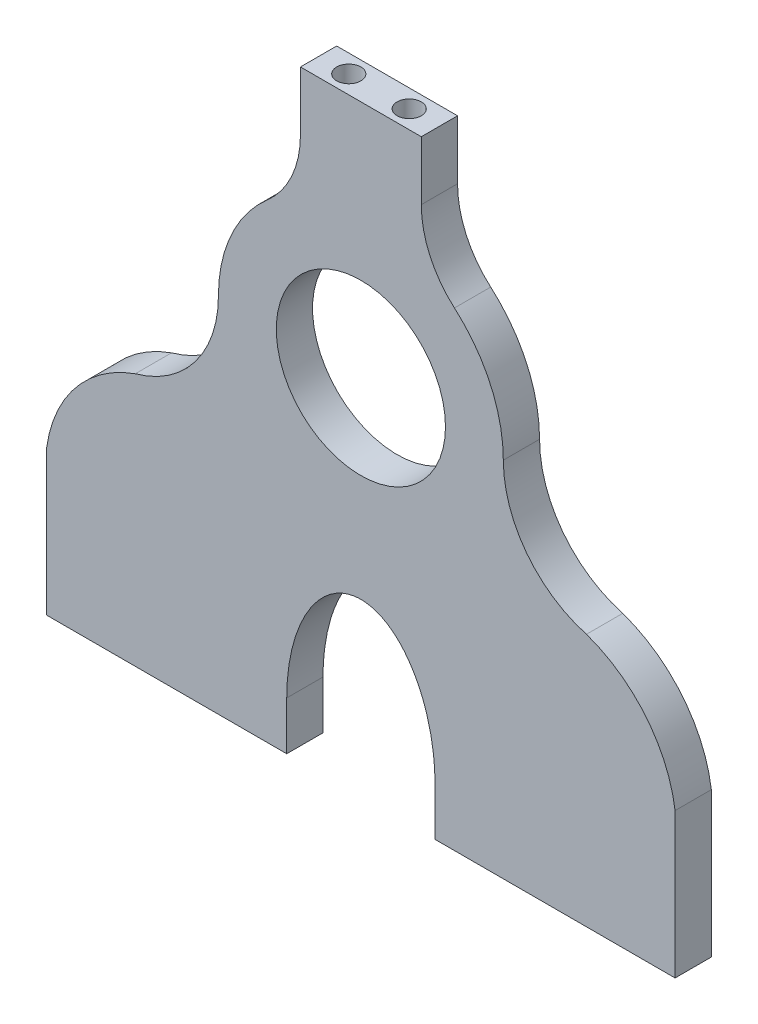
ISO-10303-21;
HEADER;
FILE_DESCRIPTION(('STEP AP214'),'2;1');
FILE_NAME('part.step','',(''),(''),'','','');
FILE_SCHEMA(('AUTOMOTIVE_DESIGN { 1 0 10303 214 1 1 1 1 }'));
ENDSEC;
DATA;
#1=APPLICATION_CONTEXT('core data for automotive mechanical design processes');
#2=APPLICATION_PROTOCOL_DEFINITION('international standard','automotive_design',2000,#1);
#3=PRODUCT_CONTEXT('',#1,'mechanical');
#4=PRODUCT('Part','Part','',(#3));
#5=PRODUCT_RELATED_PRODUCT_CATEGORY('part','',(#4));
#6=PRODUCT_DEFINITION_FORMATION('','',#4);
#7=PRODUCT_DEFINITION_CONTEXT('part definition',#1,'design');
#8=PRODUCT_DEFINITION('design','',#6,#7);
#9=PRODUCT_DEFINITION_SHAPE('','',#8);
#10=(LENGTH_UNIT() NAMED_UNIT(*) SI_UNIT(.MILLI.,.METRE.));
#11=(NAMED_UNIT(*) PLANE_ANGLE_UNIT() SI_UNIT($,.RADIAN.));
#12=(NAMED_UNIT(*) SI_UNIT($,.STERADIAN.) SOLID_ANGLE_UNIT());
#13=UNCERTAINTY_MEASURE_WITH_UNIT(LENGTH_MEASURE(1.E-05),#10,'distance_accuracy_value','');
#14=(GEOMETRIC_REPRESENTATION_CONTEXT(3) GLOBAL_UNCERTAINTY_ASSIGNED_CONTEXT((#13)) GLOBAL_UNIT_ASSIGNED_CONTEXT((#10,
#11,#12)) REPRESENTATION_CONTEXT('',''));
#15=CARTESIAN_POINT('',(0.,0.,0.));
#16=DIRECTION('',(0.,0.,1.));
#17=DIRECTION('',(1.,0.,0.));
#18=AXIS2_PLACEMENT_3D('',#15,#16,#17);
#19=CARTESIAN_POINT('',(-14.7778766476058,59.975972109678,3.175));
#20=DIRECTION('',(0.,0.,-1.));
#21=DIRECTION('',(-1.,0.,0.));
#22=AXIS2_PLACEMENT_3D('',#19,#20,#21);
#23=CYLINDRICAL_SURFACE('',#22,37.421060377554);
#24=CARTESIAN_POINT('',(-14.7778766476058,59.975972109678,9.525));
#25=DIRECTION('',(0.,0.,1.));
#26=DIRECTION('',(1.,0.,0.));
#27=AXIS2_PLACEMENT_3D('',#24,#25,#26);
#28=CIRCLE('',#27,37.4210603775539);
#29=CARTESIAN_POINT('',(22.643183729948,59.975972109678,9.525));
#30=VERTEX_POINT('',#29);
#31=CARTESIAN_POINT('',(9.80869126132126,88.1865452736578,9.525));
#32=VERTEX_POINT('',#31);
#33=EDGE_CURVE('E53',#30,#32,#28,.T.);
#34=ORIENTED_EDGE('',*,*,#33,.F.);
#35=DIRECTION('',(0.,0.,-1.));
#36=VECTOR('',#35,1.);
#37=CARTESIAN_POINT('',(22.6431837299482,59.975972109678,3.175));
#38=LINE('',#37,#36);
#39=CARTESIAN_POINT('',(22.6431837299482,59.975972109678,0.));
#40=VERTEX_POINT('',#39);
#41=EDGE_CURVE('E342',#30,#40,#38,.T.);
#42=ORIENTED_EDGE('',*,*,#41,.T.);
#43=CARTESIAN_POINT('',(-14.7778766476058,59.975972109678,0.));
#44=DIRECTION('',(0.,0.,1.));
#45=DIRECTION('',(1.,0.,0.));
#46=AXIS2_PLACEMENT_3D('',#43,#44,#45);
#47=CIRCLE('',#46,37.421060377554);
#48=CARTESIAN_POINT('',(9.80869126132126,88.1865452736578,0.));
#49=VERTEX_POINT('',#48);
#50=EDGE_CURVE('E235',#40,#49,#47,.T.);
#51=ORIENTED_EDGE('',*,*,#50,.T.);
#52=DIRECTION('',(0.,0.,-1.));
#53=VECTOR('',#52,1.);
#54=CARTESIAN_POINT('',(9.80869126132126,88.1865452736578,3.175));
#55=LINE('',#54,#53);
#56=EDGE_CURVE('E178',#49,#32,#55,.F.);
#57=ORIENTED_EDGE('',*,*,#56,.T.);
#58=EDGE_LOOP('',(#34,#42,#51,#57));
#59=FACE_BOUND('',#58,.T.);
#60=ADVANCED_FACE('F36',(#59),#23,.T.);
#61=CARTESIAN_POINT('',(1.09712335239415,0.,3.175));
#62=DIRECTION('',(-1.,0.,0.));
#63=DIRECTION('',(0.,0.,1.));
#64=AXIS2_PLACEMENT_3D('',#61,#62,#63);
#65=PLANE('',#64);
#66=DIRECTION('',(0.,1.,0.));
#67=VECTOR('',#66,1.);
#68=CARTESIAN_POINT('',(1.09712335239415,107.334815021644,9.525));
#69=LINE('',#68,#67);
#70=CARTESIAN_POINT('',(1.09712335239415,107.334815021644,9.525));
#71=VERTEX_POINT('',#70);
#72=CARTESIAN_POINT('',(1.09712335239415,122.797032487232,9.525));
#73=VERTEX_POINT('',#72);
#74=EDGE_CURVE('E163',#71,#73,#69,.T.);
#75=ORIENTED_EDGE('',*,*,#74,.F.);
#76=DIRECTION('',(0.,0.,1.));
#77=VECTOR('',#76,1.);
#78=CARTESIAN_POINT('',(1.09712335239415,107.334815021644,0.));
#79=LINE('',#78,#77);
#80=CARTESIAN_POINT('',(1.09712335239415,107.334815021644,0.));
#81=VERTEX_POINT('',#80);
#82=EDGE_CURVE('E174',#71,#81,#79,.F.);
#83=ORIENTED_EDGE('',*,*,#82,.T.);
#84=DIRECTION('',(0.,1.,0.));
#85=VECTOR('',#84,1.);
#86=CARTESIAN_POINT('',(1.09712335239415,0.,0.));
#87=LINE('',#86,#85);
#88=CARTESIAN_POINT('',(1.09712335239415,122.797032487232,0.));
#89=VERTEX_POINT('',#88);
#90=EDGE_CURVE('E242',#81,#89,#87,.T.);
#91=ORIENTED_EDGE('',*,*,#90,.T.);
#92=DIRECTION('',(0.,0.,-1.));
#93=VECTOR('',#92,1.);
#94=CARTESIAN_POINT('',(1.09712335239415,122.797032487232,3.175));
#95=LINE('',#94,#93);
#96=EDGE_CURVE('E175',#73,#89,#95,.T.);
#97=ORIENTED_EDGE('',*,*,#96,.F.);
#98=EDGE_LOOP('',(#75,#83,#91,#97));
#99=FACE_BOUND('',#98,.T.);
#100=ADVANCED_FACE('F172',(#99),#65,.F.);
#101=CARTESIAN_POINT('',(0.,122.797032487232,3.175));
#102=DIRECTION('',(0.,1.,0.));
#103=DIRECTION('',(0.,0.,1.));
#104=AXIS2_PLACEMENT_3D('',#101,#102,#103);
#105=PLANE('',#104);
#106=CARTESIAN_POINT('',(-6.84037664760585,122.797032487232,4.7625));
#107=DIRECTION('',(0.,1.,0.));
#108=DIRECTION('',(0.,0.,1.));
#109=AXIS2_PLACEMENT_3D('',#106,#107,#108);
#110=CIRCLE('',#109,3.175);
#111=CARTESIAN_POINT('',(-6.84037664760585,122.797032487232,7.9375));
#112=VERTEX_POINT('',#111);
#113=EDGE_CURVE('E426',#112,#112,#110,.T.);
#114=ORIENTED_EDGE('',*,*,#113,.F.);
#115=EDGE_LOOP('',(#114));
#116=FACE_BOUND('',#115,.T.);
#117=CARTESIAN_POINT('',(-22.7153766476059,122.797032487232,4.7625));
#118=DIRECTION('',(0.,1.,0.));
#119=DIRECTION('',(0.,0.,1.));
#120=AXIS2_PLACEMENT_3D('',#117,#118,#119);
#121=CIRCLE('',#120,3.175);
#122=CARTESIAN_POINT('',(-22.7153766476059,122.797032487232,7.9375));
#123=VERTEX_POINT('',#122);
#124=EDGE_CURVE('E420',#123,#123,#121,.T.);
#125=ORIENTED_EDGE('',*,*,#124,.F.);
#126=EDGE_LOOP('',(#125));
#127=FACE_BOUND('',#126,.T.);
#128=DIRECTION('',(0.,0.,-1.));
#129=VECTOR('',#128,1.);
#130=CARTESIAN_POINT('',(-30.6528766476059,122.797032487232,3.175));
#131=LINE('',#130,#129);
#132=CARTESIAN_POINT('',(-30.6528766476059,122.797032487232,9.525));
#133=VERTEX_POINT('',#132);
#134=CARTESIAN_POINT('',(-30.6528766476059,122.797032487232,0.));
#135=VERTEX_POINT('',#134);
#136=EDGE_CURVE('E210',#133,#135,#131,.T.);
#137=ORIENTED_EDGE('',*,*,#136,.F.);
#138=DIRECTION('',(-1.,0.,0.));
#139=VECTOR('',#138,1.);
#140=CARTESIAN_POINT('',(1.09712335239415,122.797032487232,9.525));
#141=LINE('',#140,#139);
#142=EDGE_CURVE('E176',#73,#133,#141,.T.);
#143=ORIENTED_EDGE('',*,*,#142,.F.);
#144=ORIENTED_EDGE('',*,*,#96,.T.);
#145=DIRECTION('',(1.,0.,0.));
#146=VECTOR('',#145,1.);
#147=CARTESIAN_POINT('',(0.,122.797032487232,0.));
#148=LINE('',#147,#146);
#149=EDGE_CURVE('E238',#135,#89,#148,.T.);
#150=ORIENTED_EDGE('',*,*,#149,.F.);
#151=EDGE_LOOP('',(#137,#143,#144,#150));
#152=FACE_BOUND('',#151,.T.);
#153=ADVANCED_FACE('F285',(#116,#127,#152),#105,.T.);
#154=CARTESIAN_POINT('',(-30.6528766476059,0.,3.175));
#155=DIRECTION('',(-1.,0.,0.));
#156=DIRECTION('',(0.,0.,1.));
#157=AXIS2_PLACEMENT_3D('',#154,#155,#156);
#158=PLANE('',#157);
#159=DIRECTION('',(0.,0.,-1.));
#160=VECTOR('',#159,1.);
#161=CARTESIAN_POINT('',(-30.6528766476059,107.334815021644,3.175));
#162=LINE('',#161,#160);
#163=CARTESIAN_POINT('',(-30.6528766476059,107.334815021644,0.));
#164=VERTEX_POINT('',#163);
#165=CARTESIAN_POINT('',(-30.6528766476059,107.334815021644,9.525));
#166=VERTEX_POINT('',#165);
#167=EDGE_CURVE('E179',#164,#166,#162,.F.);
#168=ORIENTED_EDGE('',*,*,#167,.T.);
#169=DIRECTION('',(0.,-1.,0.));
#170=VECTOR('',#169,1.);
#171=CARTESIAN_POINT('',(-30.6528766476059,122.797032487232,9.525));
#172=LINE('',#171,#170);
#173=EDGE_CURVE('E374',#133,#166,#172,.T.);
#174=ORIENTED_EDGE('',*,*,#173,.F.);
#175=ORIENTED_EDGE('',*,*,#136,.T.);
#176=DIRECTION('',(0.,1.,0.));
#177=VECTOR('',#176,1.);
#178=CARTESIAN_POINT('',(-30.6528766476059,0.,0.));
#179=LINE('',#178,#177);
#180=EDGE_CURVE('E233',#164,#135,#179,.T.);
#181=ORIENTED_EDGE('',*,*,#180,.F.);
#182=EDGE_LOOP('',(#168,#174,#175,#181));
#183=FACE_BOUND('',#182,.T.);
#184=ADVANCED_FACE('F282',(#183),#158,.T.);
#185=CARTESIAN_POINT('',(-14.7778766476058,59.975972109678,9.525));
#186=DIRECTION('',(0.,0.,1.));
#187=DIRECTION('',(1.,0.,0.));
#188=AXIS2_PLACEMENT_3D('',#185,#186,#187);
#189=CIRCLE('',#188,37.421060377554);
#190=CARTESIAN_POINT('',(-39.364444556533,88.1865452736578,9.525));
#191=VERTEX_POINT('',#190);
#192=CARTESIAN_POINT('',(-52.1989370251598,59.975972109678,9.525));
#193=VERTEX_POINT('',#192);
#194=EDGE_CURVE('E222',#191,#193,#189,.T.);
#195=ORIENTED_EDGE('',*,*,#194,.F.);
#196=DIRECTION('',(0.,0.,-1.));
#197=VECTOR('',#196,1.);
#198=CARTESIAN_POINT('',(-39.3644445565329,88.1865452736578,3.175));
#199=LINE('',#198,#197);
#200=CARTESIAN_POINT('',(-39.364444556533,88.1865452736578,0.));
#201=VERTEX_POINT('',#200);
#202=EDGE_CURVE('E183',#191,#201,#199,.T.);
#203=ORIENTED_EDGE('',*,*,#202,.T.);
#204=CARTESIAN_POINT('',(-52.1989370251599,59.975972109678,0.));
#205=VERTEX_POINT('',#204);
#206=EDGE_CURVE('E220',#201,#205,#47,.T.);
#207=ORIENTED_EDGE('',*,*,#206,.T.);
#208=DIRECTION('',(0.,0.,-1.));
#209=VECTOR('',#208,1.);
#210=CARTESIAN_POINT('',(-52.1989370251599,59.975972109678,3.175));
#211=LINE('',#210,#209);
#212=EDGE_CURVE('E208',#193,#205,#211,.T.);
#213=ORIENTED_EDGE('',*,*,#212,.F.);
#214=EDGE_LOOP('',(#195,#203,#207,#213));
#215=FACE_BOUND('',#214,.T.);
#216=ADVANCED_FACE('F217',(#215),#23,.T.);
#217=CARTESIAN_POINT('',(-81.9577291629993,59.9759721096779,3.175));
#218=DIRECTION('',(0.,0.,-1.));
#219=DIRECTION('',(-1.,0.,0.));
#220=AXIS2_PLACEMENT_3D('',#217,#218,#219);
#221=CYLINDRICAL_SURFACE('',#220,29.7587921378395);
#222=DIRECTION('',(0.,0.,-1.));
#223=VECTOR('',#222,1.);
#224=CARTESIAN_POINT('',(-74.0454210461597,31.2883251206457,3.175));
#225=LINE('',#224,#223);
#226=CARTESIAN_POINT('',(-74.0454210461598,31.2883251206457,9.525));
#227=VERTEX_POINT('',#226);
#228=CARTESIAN_POINT('',(-74.0454210461597,31.2883251206457,0.));
#229=VERTEX_POINT('',#228);
#230=EDGE_CURVE('E206',#227,#229,#225,.T.);
#231=ORIENTED_EDGE('',*,*,#230,.F.);
#232=CARTESIAN_POINT('',(-81.9577291629993,59.9759721096779,9.525));
#233=DIRECTION('',(0.,0.,-1.));
#234=DIRECTION('',(1.,0.,0.));
#235=AXIS2_PLACEMENT_3D('',#232,#233,#234);
#236=CIRCLE('',#235,29.7587921378395);
#237=EDGE_CURVE('E381',#193,#227,#236,.T.);
#238=ORIENTED_EDGE('',*,*,#237,.F.);
#239=ORIENTED_EDGE('',*,*,#212,.T.);
#240=CARTESIAN_POINT('',(-81.9577291629993,59.9759721096779,0.));
#241=DIRECTION('',(0.,0.,1.));
#242=DIRECTION('',(1.,0.,0.));
#243=AXIS2_PLACEMENT_3D('',#240,#241,#242);
#244=CIRCLE('',#243,29.7587921378395);
#245=EDGE_CURVE('E232',#229,#205,#244,.T.);
#246=ORIENTED_EDGE('',*,*,#245,.F.);
#247=EDGE_LOOP('',(#231,#238,#239,#246));
#248=FACE_BOUND('',#247,.T.);
#249=ADVANCED_FACE('F275',(#248),#221,.F.);
#250=CARTESIAN_POINT('',(-62.4213433140019,-1.97407634767413,3.175));
#251=DIRECTION('',(0.,0.,-1.));
#252=DIRECTION('',(-1.,0.,0.));
#253=AXIS2_PLACEMENT_3D('',#250,#251,#252);
#254=CYLINDRICAL_SURFACE('',#253,35.2350185832636);
#255=DIRECTION('',(0.,0.,-1.));
#256=VECTOR('',#255,1.);
#257=CARTESIAN_POINT('',(-97.3278766476058,2.82597210967795,3.175));
#258=LINE('',#257,#256);
#259=CARTESIAN_POINT('',(-97.3278766476058,2.82597210967795,9.525));
#260=VERTEX_POINT('',#259);
#261=CARTESIAN_POINT('',(-97.3278766476058,2.82597210967795,0.));
#262=VERTEX_POINT('',#261);
#263=EDGE_CURVE('E204',#260,#262,#258,.T.);
#264=ORIENTED_EDGE('',*,*,#263,.F.);
#265=CARTESIAN_POINT('',(-62.4213433140019,-1.97407634767413,9.525));
#266=DIRECTION('',(0.,0.,1.));
#267=DIRECTION('',(1.,0.,0.));
#268=AXIS2_PLACEMENT_3D('',#265,#266,#267);
#269=CIRCLE('',#268,35.2350185832636);
#270=EDGE_CURVE('E383',#227,#260,#269,.T.);
#271=ORIENTED_EDGE('',*,*,#270,.F.);
#272=ORIENTED_EDGE('',*,*,#230,.T.);
#273=CARTESIAN_POINT('',(-62.4213433140019,-1.97407634767413,0.));
#274=DIRECTION('',(0.,0.,1.));
#275=DIRECTION('',(1.,0.,0.));
#276=AXIS2_PLACEMENT_3D('',#273,#274,#275);
#277=CIRCLE('',#276,35.2350185832636);
#278=EDGE_CURVE('E236',#262,#229,#277,.F.);
#279=ORIENTED_EDGE('',*,*,#278,.F.);
#280=EDGE_LOOP('',(#264,#271,#272,#279));
#281=FACE_BOUND('',#280,.T.);
#282=ADVANCED_FACE('F271',(#281),#254,.T.);
#283=CARTESIAN_POINT('',(-97.3278766476058,1.06353985818946E-13,3.175));
#284=DIRECTION('',(-1.,0.,0.));
#285=DIRECTION('',(0.,-1.,0.));
#286=AXIS2_PLACEMENT_3D('',#283,#284,#285);
#287=PLANE('',#286);
#288=DIRECTION('',(0.,0.,-1.));
#289=VECTOR('',#288,1.);
#290=CARTESIAN_POINT('',(-97.3278766476058,-35.2740278903221,3.175));
#291=LINE('',#290,#289);
#292=CARTESIAN_POINT('',(-97.3278766476058,-35.2740278903221,9.525));
#293=VERTEX_POINT('',#292);
#294=CARTESIAN_POINT('',(-97.3278766476058,-35.2740278903221,0.));
#295=VERTEX_POINT('',#294);
#296=EDGE_CURVE('E202',#293,#295,#291,.T.);
#297=ORIENTED_EDGE('',*,*,#296,.F.);
#298=DIRECTION('',(0.,-1.,0.));
#299=VECTOR('',#298,1.);
#300=CARTESIAN_POINT('',(-97.3278766476058,2.82597210967795,9.525));
#301=LINE('',#300,#299);
#302=EDGE_CURVE('E385',#260,#293,#301,.T.);
#303=ORIENTED_EDGE('',*,*,#302,.F.);
#304=ORIENTED_EDGE('',*,*,#263,.T.);
#305=DIRECTION('',(0.,1.,0.));
#306=VECTOR('',#305,1.);
#307=CARTESIAN_POINT('',(-97.3278766476058,1.06353985818946E-13,0.));
#308=LINE('',#307,#306);
#309=EDGE_CURVE('E365',#295,#262,#308,.T.);
#310=ORIENTED_EDGE('',*,*,#309,.F.);
#311=EDGE_LOOP('',(#297,#303,#304,#310));
#312=FACE_BOUND('',#311,.T.);
#313=ADVANCED_FACE('F267',(#312),#287,.T.);
#314=CARTESIAN_POINT('',(0.,-35.274027890322,3.175));
#315=DIRECTION('',(0.,-1.,0.));
#316=DIRECTION('',(1.,0.,0.));
#317=AXIS2_PLACEMENT_3D('',#314,#315,#316);
#318=PLANE('',#317);
#319=CARTESIAN_POINT('',(-81.5602529162692,-35.274027890322,4.7625));
#320=DIRECTION('',(0.,-1.,0.));
#321=DIRECTION('',(1.,0.,0.));
#322=AXIS2_PLACEMENT_3D('',#319,#320,#321);
#323=CIRCLE('',#322,3.175);
#324=CARTESIAN_POINT('',(-78.3852529162692,-35.274027890322,4.7625));
#325=VERTEX_POINT('',#324);
#326=EDGE_CURVE('E406',#325,#325,#323,.T.);
#327=ORIENTED_EDGE('',*,*,#326,.F.);
#328=EDGE_LOOP('',(#327));
#329=FACE_BOUND('',#328,.T.);
#330=CARTESIAN_POINT('',(-50.025005453596,-35.274027890322,4.7625));
#331=DIRECTION('',(0.,-1.,0.));
#332=DIRECTION('',(1.,0.,0.));
#333=AXIS2_PLACEMENT_3D('',#330,#331,#332);
#334=CIRCLE('',#333,3.175);
#335=CARTESIAN_POINT('',(-46.850005453596,-35.274027890322,4.7625));
#336=VERTEX_POINT('',#335);
#337=EDGE_CURVE('E400',#336,#336,#334,.T.);
#338=ORIENTED_EDGE('',*,*,#337,.F.);
#339=EDGE_LOOP('',(#338));
#340=FACE_BOUND('',#339,.T.);
#341=DIRECTION('',(0.,0.,-1.));
#342=VECTOR('',#341,1.);
#343=CARTESIAN_POINT('',(-34.2573817222593,-35.274027890322,3.175));
#344=LINE('',#343,#342);
#345=CARTESIAN_POINT('',(-34.2573817222593,-35.274027890322,9.525));
#346=VERTEX_POINT('',#345);
#347=CARTESIAN_POINT('',(-34.2573817222593,-35.274027890322,0.));
#348=VERTEX_POINT('',#347);
#349=EDGE_CURVE('E200',#346,#348,#344,.T.);
#350=ORIENTED_EDGE('',*,*,#349,.F.);
#351=DIRECTION('',(1.,0.,0.));
#352=VECTOR('',#351,1.);
#353=CARTESIAN_POINT('',(-97.3278766476058,-35.2740278903221,9.525));
#354=LINE('',#353,#352);
#355=EDGE_CURVE('E387',#293,#346,#354,.T.);
#356=ORIENTED_EDGE('',*,*,#355,.F.);
#357=ORIENTED_EDGE('',*,*,#296,.T.);
#358=DIRECTION('',(-1.,0.,0.));
#359=VECTOR('',#358,1.);
#360=CARTESIAN_POINT('',(0.,-35.274027890322,0.));
#361=LINE('',#360,#359);
#362=EDGE_CURVE('E362',#348,#295,#361,.T.);
#363=ORIENTED_EDGE('',*,*,#362,.F.);
#364=EDGE_LOOP('',(#350,#356,#357,#363));
#365=FACE_BOUND('',#364,.T.);
#366=ADVANCED_FACE('F263',(#329,#340,#365),#318,.T.);
#367=CARTESIAN_POINT('',(-34.2573817222593,0.,3.175));
#368=DIRECTION('',(1.,0.,0.));
#369=DIRECTION('',(0.,0.,-1.));
#370=AXIS2_PLACEMENT_3D('',#367,#368,#369);
#371=PLANE('',#370);
#372=DIRECTION('',(0.,0.,-1.));
#373=VECTOR('',#372,1.);
#374=CARTESIAN_POINT('',(-34.2573817222593,-22.574027890322,3.175));
#375=LINE('',#374,#373);
#376=CARTESIAN_POINT('',(-34.2573817222593,-22.574027890322,9.525));
#377=VERTEX_POINT('',#376);
#378=CARTESIAN_POINT('',(-34.2573817222593,-22.574027890322,0.));
#379=VERTEX_POINT('',#378);
#380=EDGE_CURVE('E191',#377,#379,#375,.T.);
#381=ORIENTED_EDGE('',*,*,#380,.F.);
#382=DIRECTION('',(0.,1.,0.));
#383=VECTOR('',#382,1.);
#384=CARTESIAN_POINT('',(-34.2573817222593,-35.274027890322,9.525));
#385=LINE('',#384,#383);
#386=EDGE_CURVE('E389',#346,#377,#385,.T.);
#387=ORIENTED_EDGE('',*,*,#386,.F.);
#388=ORIENTED_EDGE('',*,*,#349,.T.);
#389=DIRECTION('',(0.,-1.,0.));
#390=VECTOR('',#389,1.);
#391=CARTESIAN_POINT('',(-34.2573817222593,0.,0.));
#392=LINE('',#391,#390);
#393=EDGE_CURVE('E359',#379,#348,#392,.T.);
#394=ORIENTED_EDGE('',*,*,#393,.F.);
#395=EDGE_LOOP('',(#381,#387,#388,#394));
#396=FACE_BOUND('',#395,.T.);
#397=ADVANCED_FACE('F258',(#396),#371,.T.);
#398=CARTESIAN_POINT('',(-14.7778766476058,-22.574027890322,3.175));
#399=DIRECTION('',(0.,0.,1.));
#400=DIRECTION('',(0.,-1.,0.));
#401=AXIS2_PLACEMENT_3D('',#398,#399,#400);
#402=ELLIPSE('',#401,32.1694990627198,19.4795050746535);
#403=DIRECTION('',(0.,0.,-1.));
#404=VECTOR('',#403,1.);
#405=SURFACE_OF_LINEAR_EXTRUSION('',#402,#404);
#406=DIRECTION('',(0.,0.,-1.));
#407=VECTOR('',#406,1.);
#408=CARTESIAN_POINT('',(4.70162842704766,-22.574027890322,3.175));
#409=LINE('',#408,#407);
#410=CARTESIAN_POINT('',(4.70162842704766,-22.574027890322,9.525));
#411=VERTEX_POINT('',#410);
#412=CARTESIAN_POINT('',(4.70162842704766,-22.574027890322,0.));
#413=VERTEX_POINT('',#412);
#414=EDGE_CURVE('E188',#411,#413,#409,.T.);
#415=ORIENTED_EDGE('',*,*,#414,.F.);
#416=CARTESIAN_POINT('',(-14.7778766476058,-22.574027890322,9.525));
#417=DIRECTION('',(0.,0.,-1.));
#418=DIRECTION('',(0.,-1.,0.));
#419=AXIS2_PLACEMENT_3D('',#416,#417,#418);
#420=ELLIPSE('',#419,32.1694990627198,19.4795050746535);
#421=EDGE_CURVE('E793',#377,#411,#420,.T.);
#422=ORIENTED_EDGE('',*,*,#421,.F.);
#423=ORIENTED_EDGE('',*,*,#380,.T.);
#424=CARTESIAN_POINT('',(-14.7778766476058,-22.574027890322,0.));
#425=DIRECTION('',(0.,0.,1.));
#426=DIRECTION('',(0.,-1.,0.));
#427=AXIS2_PLACEMENT_3D('',#424,#425,#426);
#428=ELLIPSE('',#427,32.1694990627198,19.4795050746535);
#429=EDGE_CURVE('E356',#413,#379,#428,.T.);
#430=ORIENTED_EDGE('',*,*,#429,.F.);
#431=EDGE_LOOP('',(#415,#422,#423,#430));
#432=FACE_BOUND('',#431,.T.);
#433=ADVANCED_FACE('F253',(#432),#405,.T.);
#434=CARTESIAN_POINT('',(4.70162842704765,0.,3.175));
#435=DIRECTION('',(1.,0.,0.));
#436=DIRECTION('',(0.,1.,0.));
#437=AXIS2_PLACEMENT_3D('',#434,#435,#436);
#438=PLANE('',#437);
#439=DIRECTION('',(0.,-1.,0.));
#440=VECTOR('',#439,1.);
#441=CARTESIAN_POINT('',(4.70162842704766,-22.574027890322,9.525));
#442=LINE('',#441,#440);
#443=CARTESIAN_POINT('',(4.70162842704766,-35.274027890322,9.525));
#444=VERTEX_POINT('',#443);
#445=EDGE_CURVE('E390',#411,#444,#442,.T.);
#446=ORIENTED_EDGE('',*,*,#445,.F.);
#447=ORIENTED_EDGE('',*,*,#414,.T.);
#448=DIRECTION('',(0.,-1.,0.));
#449=VECTOR('',#448,1.);
#450=CARTESIAN_POINT('',(4.70162842704765,0.,0.));
#451=LINE('',#450,#449);
#452=CARTESIAN_POINT('',(4.70162842704766,-35.274027890322,0.));
#453=VERTEX_POINT('',#452);
#454=EDGE_CURVE('E353',#413,#453,#451,.T.);
#455=ORIENTED_EDGE('',*,*,#454,.T.);
#456=DIRECTION('',(0.,0.,-1.));
#457=VECTOR('',#456,1.);
#458=CARTESIAN_POINT('',(4.70162842704766,-35.274027890322,3.175));
#459=LINE('',#458,#457);
#460=EDGE_CURVE('E192',#444,#453,#459,.T.);
#461=ORIENTED_EDGE('',*,*,#460,.F.);
#462=EDGE_LOOP('',(#446,#447,#455,#461));
#463=FACE_BOUND('',#462,.T.);
#464=ADVANCED_FACE('F257',(#463),#438,.F.);
#465=CARTESIAN_POINT('',(0.,-35.274027890322,3.175));
#466=DIRECTION('',(0.,-1.,0.));
#467=DIRECTION('',(1.,0.,0.));
#468=AXIS2_PLACEMENT_3D('',#465,#466,#467);
#469=PLANE('',#468);
#470=CARTESIAN_POINT('',(52.0044996210575,-35.274027890322,4.7625));
#471=DIRECTION('',(0.,-1.,0.));
#472=DIRECTION('',(-1.,0.,0.));
#473=AXIS2_PLACEMENT_3D('',#470,#471,#472);
#474=CIRCLE('',#473,3.175);
#475=CARTESIAN_POINT('',(48.8294996210575,-35.274027890322,4.7625));
#476=VERTEX_POINT('',#475);
#477=EDGE_CURVE('E321',#476,#476,#474,.T.);
#478=ORIENTED_EDGE('',*,*,#477,.F.);
#479=EDGE_LOOP('',(#478));
#480=FACE_BOUND('',#479,.T.);
#481=CARTESIAN_POINT('',(20.4692521583843,-35.274027890322,4.7625));
#482=DIRECTION('',(0.,-1.,0.));
#483=DIRECTION('',(-1.,0.,0.));
#484=AXIS2_PLACEMENT_3D('',#481,#482,#483);
#485=CIRCLE('',#484,3.175);
#486=CARTESIAN_POINT('',(17.2942521583843,-35.274027890322,4.7625));
#487=VERTEX_POINT('',#486);
#488=EDGE_CURVE('E325',#487,#487,#485,.T.);
#489=ORIENTED_EDGE('',*,*,#488,.F.);
#490=EDGE_LOOP('',(#489));
#491=FACE_BOUND('',#490,.T.);
#492=DIRECTION('',(0.,0.,-1.));
#493=VECTOR('',#492,1.);
#494=CARTESIAN_POINT('',(67.7721233523942,-35.274027890322,3.175));
#495=LINE('',#494,#493);
#496=CARTESIAN_POINT('',(67.7721233523942,-35.274027890322,9.525));
#497=VERTEX_POINT('',#496);
#498=CARTESIAN_POINT('',(67.7721233523942,-35.274027890322,0.));
#499=VERTEX_POINT('',#498);
#500=EDGE_CURVE('E329',#497,#499,#495,.T.);
#501=ORIENTED_EDGE('',*,*,#500,.F.);
#502=DIRECTION('',(1.,0.,0.));
#503=VECTOR('',#502,1.);
#504=CARTESIAN_POINT('',(4.70162842704766,-35.274027890322,9.525));
#505=LINE('',#504,#503);
#506=EDGE_CURVE('E330',#444,#497,#505,.T.);
#507=ORIENTED_EDGE('',*,*,#506,.F.);
#508=ORIENTED_EDGE('',*,*,#460,.T.);
#509=DIRECTION('',(-1.,0.,0.));
#510=VECTOR('',#509,1.);
#511=CARTESIAN_POINT('',(0.,-35.274027890322,0.));
#512=LINE('',#511,#510);
#513=EDGE_CURVE('E333',#499,#453,#512,.T.);
#514=ORIENTED_EDGE('',*,*,#513,.F.);
#515=EDGE_LOOP('',(#501,#507,#508,#514));
#516=FACE_BOUND('',#515,.T.);
#517=ADVANCED_FACE('F310',(#480,#491,#516),#469,.T.);
#518=CARTESIAN_POINT('',(67.7721233523942,0.,3.175));
#519=DIRECTION('',(-1.,0.,0.));
#520=DIRECTION('',(0.,-1.,0.));
#521=AXIS2_PLACEMENT_3D('',#518,#519,#520);
#522=PLANE('',#521);
#523=DIRECTION('',(0.,1.,0.));
#524=VECTOR('',#523,1.);
#525=CARTESIAN_POINT('',(67.7721233523942,-35.274027890322,9.525));
#526=LINE('',#525,#524);
#527=CARTESIAN_POINT('',(67.7721233523943,2.82597210967799,9.525));
#528=VERTEX_POINT('',#527);
#529=EDGE_CURVE('E248',#497,#528,#526,.T.);
#530=ORIENTED_EDGE('',*,*,#529,.F.);
#531=ORIENTED_EDGE('',*,*,#500,.T.);
#532=DIRECTION('',(0.,1.,0.));
#533=VECTOR('',#532,1.);
#534=CARTESIAN_POINT('',(67.7721233523942,0.,0.));
#535=LINE('',#534,#533);
#536=CARTESIAN_POINT('',(67.7721233523942,2.82597210967797,0.));
#537=VERTEX_POINT('',#536);
#538=EDGE_CURVE('E350',#499,#537,#535,.T.);
#539=ORIENTED_EDGE('',*,*,#538,.T.);
#540=DIRECTION('',(0.,0.,-1.));
#541=VECTOR('',#540,1.);
#542=CARTESIAN_POINT('',(67.7721233523942,2.82597210967797,3.175));
#543=LINE('',#542,#541);
#544=EDGE_CURVE('E337',#528,#537,#543,.T.);
#545=ORIENTED_EDGE('',*,*,#544,.F.);
#546=EDGE_LOOP('',(#530,#531,#539,#545));
#547=FACE_BOUND('',#546,.T.);
#548=ADVANCED_FACE('F303',(#547),#522,.F.);
#549=CARTESIAN_POINT('',(32.8655900187902,-1.97407634767412,3.175));
#550=DIRECTION('',(0.,0.,-1.));
#551=DIRECTION('',(-1.,0.,0.));
#552=AXIS2_PLACEMENT_3D('',#549,#550,#551);
#553=CYLINDRICAL_SURFACE('',#552,35.2350185832637);
#554=CARTESIAN_POINT('',(32.8655900187902,-1.97407634767412,9.525));
#555=DIRECTION('',(0.,0.,1.));
#556=DIRECTION('',(1.,0.,0.));
#557=AXIS2_PLACEMENT_3D('',#554,#555,#556);
#558=CIRCLE('',#557,35.2350185832638);
#559=CARTESIAN_POINT('',(44.4896677509479,31.2883251206461,9.525));
#560=VERTEX_POINT('',#559);
#561=EDGE_CURVE('E245',#528,#560,#558,.T.);
#562=ORIENTED_EDGE('',*,*,#561,.F.);
#563=ORIENTED_EDGE('',*,*,#544,.T.);
#564=CARTESIAN_POINT('',(32.8655900187902,-1.97407634767412,0.));
#565=DIRECTION('',(0.,0.,1.));
#566=DIRECTION('',(1.,0.,0.));
#567=AXIS2_PLACEMENT_3D('',#564,#565,#566);
#568=CIRCLE('',#567,35.2350185832637);
#569=CARTESIAN_POINT('',(44.4896677509479,31.288325120646,0.));
#570=VERTEX_POINT('',#569);
#571=EDGE_CURVE('E347',#537,#570,#568,.T.);
#572=ORIENTED_EDGE('',*,*,#571,.T.);
#573=DIRECTION('',(0.,0.,-1.));
#574=VECTOR('',#573,1.);
#575=CARTESIAN_POINT('',(44.4896677509479,31.288325120646,3.175));
#576=LINE('',#575,#574);
#577=EDGE_CURVE('E338',#560,#570,#576,.T.);
#578=ORIENTED_EDGE('',*,*,#577,.F.);
#579=EDGE_LOOP('',(#562,#563,#572,#578));
#580=FACE_BOUND('',#579,.T.);
#581=ADVANCED_FACE('F297',(#580),#553,.T.);
#582=CARTESIAN_POINT('',(52.4019758677874,59.9759721096782,3.175));
#583=DIRECTION('',(0.,0.,-1.));
#584=DIRECTION('',(-1.,0.,0.));
#585=AXIS2_PLACEMENT_3D('',#582,#583,#584);
#586=CYLINDRICAL_SURFACE('',#585,29.7587921378394);
#587=CARTESIAN_POINT('',(52.4019758677874,59.9759721096782,9.525));
#588=DIRECTION('',(0.,0.,-1.));
#589=DIRECTION('',(1.,0.,0.));
#590=AXIS2_PLACEMENT_3D('',#587,#588,#589);
#591=CIRCLE('',#590,29.7587921378393);
#592=EDGE_CURVE('E243',#560,#30,#591,.T.);
#593=ORIENTED_EDGE('',*,*,#592,.F.);
#594=ORIENTED_EDGE('',*,*,#577,.T.);
#595=CARTESIAN_POINT('',(52.4019758677874,59.9759721096782,0.));
#596=DIRECTION('',(0.,0.,1.));
#597=DIRECTION('',(1.,0.,0.));
#598=AXIS2_PLACEMENT_3D('',#595,#596,#597);
#599=CIRCLE('',#598,29.7587921378394);
#600=EDGE_CURVE('E344',#570,#40,#599,.F.);
#601=ORIENTED_EDGE('',*,*,#600,.T.);
#602=ORIENTED_EDGE('',*,*,#41,.F.);
#603=EDGE_LOOP('',(#593,#594,#601,#602));
#604=FACE_BOUND('',#603,.T.);
#605=ADVANCED_FACE('F292',(#604),#586,.F.);
#606=CARTESIAN_POINT('',(-56.0528766476058,107.334815021644,3.175));
#607=DIRECTION('',(0.,0.,-1.));
#608=DIRECTION('',(-1.,0.,0.));
#609=AXIS2_PLACEMENT_3D('',#606,#607,#608);
#610=CYLINDRICAL_SURFACE('',#609,25.4);
#611=CARTESIAN_POINT('',(-56.0528766476058,107.334815021644,9.525));
#612=DIRECTION('',(0.,0.,-1.));
#613=DIRECTION('',(1.,0.,0.));
#614=AXIS2_PLACEMENT_3D('',#611,#612,#613);
#615=CIRCLE('',#614,25.4);
#616=EDGE_CURVE('E376',#166,#191,#615,.T.);
#617=ORIENTED_EDGE('',*,*,#616,.F.);
#618=ORIENTED_EDGE('',*,*,#167,.F.);
#619=CARTESIAN_POINT('',(-56.0528766476058,107.334815021644,0.));
#620=DIRECTION('',(0.,0.,1.));
#621=DIRECTION('',(1.,0.,0.));
#622=AXIS2_PLACEMENT_3D('',#619,#620,#621);
#623=CIRCLE('',#622,25.4);
#624=EDGE_CURVE('E45',#201,#164,#623,.T.);
#625=ORIENTED_EDGE('',*,*,#624,.F.);
#626=ORIENTED_EDGE('',*,*,#202,.F.);
#627=EDGE_LOOP('',(#617,#618,#625,#626));
#628=FACE_BOUND('',#627,.T.);
#629=ADVANCED_FACE('F226',(#628),#610,.F.);
#630=CARTESIAN_POINT('',(26.4971233523941,107.334815021644,3.175));
#631=DIRECTION('',(0.,0.,-1.));
#632=DIRECTION('',(-1.,0.,0.));
#633=AXIS2_PLACEMENT_3D('',#630,#631,#632);
#634=CYLINDRICAL_SURFACE('',#633,25.4);
#635=CARTESIAN_POINT('',(26.4971233523941,107.334815021644,9.525));
#636=DIRECTION('',(0.,0.,-1.));
#637=DIRECTION('',(1.,0.,0.));
#638=AXIS2_PLACEMENT_3D('',#635,#636,#637);
#639=CIRCLE('',#638,25.4);
#640=EDGE_CURVE('E160',#32,#71,#639,.T.);
#641=ORIENTED_EDGE('',*,*,#640,.F.);
#642=ORIENTED_EDGE('',*,*,#56,.F.);
#643=CARTESIAN_POINT('',(26.4971233523941,107.334815021644,0.));
#644=DIRECTION('',(0.,0.,1.));
#645=DIRECTION('',(1.,0.,0.));
#646=AXIS2_PLACEMENT_3D('',#643,#644,#645);
#647=CIRCLE('',#646,25.4);
#648=EDGE_CURVE('E11',#81,#49,#647,.T.);
#649=ORIENTED_EDGE('',*,*,#648,.F.);
#650=ORIENTED_EDGE('',*,*,#82,.F.);
#651=EDGE_LOOP('',(#641,#642,#649,#650));
#652=FACE_BOUND('',#651,.T.);
#653=ADVANCED_FACE('F38',(#652),#634,.F.);
#654=CARTESIAN_POINT('',(0.,0.,0.));
#655=DIRECTION('',(0.,0.,1.));
#656=DIRECTION('',(1.,0.,0.));
#657=AXIS2_PLACEMENT_3D('',#654,#655,#656);
#658=PLANE('',#657);
#659=CARTESIAN_POINT('',(-14.7778766476058,59.975972109678,0.));
#660=DIRECTION('',(0.,0.,1.));
#661=DIRECTION('',(1.,0.,0.));
#662=AXIS2_PLACEMENT_3D('',#659,#660,#661);
#663=CIRCLE('',#662,22.225);
#664=CARTESIAN_POINT('',(7.44712335239416,59.975972109678,0.));
#665=VERTEX_POINT('',#664);
#666=EDGE_CURVE('E429',#665,#665,#663,.T.);
#667=ORIENTED_EDGE('',*,*,#666,.T.);
#668=EDGE_LOOP('',(#667));
#669=FACE_BOUND('',#668,.T.);
#670=ORIENTED_EDGE('',*,*,#50,.F.);
#671=ORIENTED_EDGE('',*,*,#600,.F.);
#672=ORIENTED_EDGE('',*,*,#571,.F.);
#673=ORIENTED_EDGE('',*,*,#538,.F.);
#674=ORIENTED_EDGE('',*,*,#513,.T.);
#675=ORIENTED_EDGE('',*,*,#454,.F.);
#676=ORIENTED_EDGE('',*,*,#429,.T.);
#677=ORIENTED_EDGE('',*,*,#393,.T.);
#678=ORIENTED_EDGE('',*,*,#362,.T.);
#679=ORIENTED_EDGE('',*,*,#309,.T.);
#680=ORIENTED_EDGE('',*,*,#278,.T.);
#681=ORIENTED_EDGE('',*,*,#245,.T.);
#682=ORIENTED_EDGE('',*,*,#206,.F.);
#683=ORIENTED_EDGE('',*,*,#624,.T.);
#684=ORIENTED_EDGE('',*,*,#180,.T.);
#685=ORIENTED_EDGE('',*,*,#149,.T.);
#686=ORIENTED_EDGE('',*,*,#90,.F.);
#687=ORIENTED_EDGE('',*,*,#648,.T.);
#688=EDGE_LOOP('',(#670,#671,#672,#673,#674,#675,#676,#677,#678,#679,#680,#681,#682,#683,#684,
#685,#686,#687));
#689=FACE_BOUND('',#688,.T.);
#690=ADVANCED_FACE('F229',(#669,#689),#658,.F.);
#691=CARTESIAN_POINT('',(-14.7778766476058,-22.574027890322,9.525));
#692=DIRECTION('',(0.,0.,1.));
#693=DIRECTION('',(1.,0.,0.));
#694=AXIS2_PLACEMENT_3D('',#691,#692,#693);
#695=PLANE('',#694);
#696=CARTESIAN_POINT('',(-14.7778766476058,59.975972109678,9.525));
#697=DIRECTION('',(0.,0.,1.));
#698=DIRECTION('',(1.,0.,0.));
#699=AXIS2_PLACEMENT_3D('',#696,#697,#698);
#700=CIRCLE('',#699,22.225);
#701=CARTESIAN_POINT('',(7.44712335239416,59.975972109678,9.525));
#702=VERTEX_POINT('',#701);
#703=EDGE_CURVE('E434',#702,#702,#700,.T.);
#704=ORIENTED_EDGE('',*,*,#703,.F.);
#705=EDGE_LOOP('',(#704));
#706=FACE_BOUND('',#705,.T.);
#707=ORIENTED_EDGE('',*,*,#33,.T.);
#708=ORIENTED_EDGE('',*,*,#640,.T.);
#709=ORIENTED_EDGE('',*,*,#74,.T.);
#710=ORIENTED_EDGE('',*,*,#142,.T.);
#711=ORIENTED_EDGE('',*,*,#173,.T.);
#712=ORIENTED_EDGE('',*,*,#616,.T.);
#713=ORIENTED_EDGE('',*,*,#194,.T.);
#714=ORIENTED_EDGE('',*,*,#237,.T.);
#715=ORIENTED_EDGE('',*,*,#270,.T.);
#716=ORIENTED_EDGE('',*,*,#302,.T.);
#717=ORIENTED_EDGE('',*,*,#355,.T.);
#718=ORIENTED_EDGE('',*,*,#386,.T.);
#719=ORIENTED_EDGE('',*,*,#421,.T.);
#720=ORIENTED_EDGE('',*,*,#445,.T.);
#721=ORIENTED_EDGE('',*,*,#506,.T.);
#722=ORIENTED_EDGE('',*,*,#529,.T.);
#723=ORIENTED_EDGE('',*,*,#561,.T.);
#724=ORIENTED_EDGE('',*,*,#592,.T.);
#725=EDGE_LOOP('',(#707,#708,#709,#710,#711,#712,#713,#714,#715,#716,#717,#718,#719,#720,#721,
#722,#723,#724));
#726=FACE_BOUND('',#725,.T.);
#727=ADVANCED_FACE('F162',(#706,#726),#695,.T.);
#728=CARTESIAN_POINT('',(-50.025005453596,-22.574027890322,4.7625));
#729=DIRECTION('',(0.,-1.,0.));
#730=DIRECTION('',(1.,0.,0.));
#731=AXIS2_PLACEMENT_3D('',#728,#729,#730);
#732=CYLINDRICAL_SURFACE('',#731,3.175);
#733=CARTESIAN_POINT('',(-50.025005453596,-22.574027890322,4.7625));
#734=DIRECTION('',(0.,-1.,0.));
#735=DIRECTION('',(1.,0.,0.));
#736=AXIS2_PLACEMENT_3D('',#733,#734,#735);
#737=CIRCLE('',#736,3.175);
#738=CARTESIAN_POINT('',(-46.850005453596,-22.574027890322,4.7625));
#739=VERTEX_POINT('',#738);
#740=EDGE_CURVE('E397',#739,#739,#737,.T.);
#741=ORIENTED_EDGE('',*,*,#740,.F.);
#742=EDGE_LOOP('',(#741));
#743=FACE_BOUND('',#742,.T.);
#744=ORIENTED_EDGE('',*,*,#337,.T.);
#745=EDGE_LOOP('',(#744));
#746=FACE_BOUND('',#745,.T.);
#747=ADVANCED_FACE('F442',(#743,#746),#732,.F.);
#748=CARTESIAN_POINT('',(-50.025005453596,-22.574027890322,4.7625));
#749=DIRECTION('',(0.,-1.,0.));
#750=DIRECTION('',(1.,0.,0.));
#751=AXIS2_PLACEMENT_3D('',#748,#749,#750);
#752=PLANE('',#751);
#753=ORIENTED_EDGE('',*,*,#740,.T.);
#754=EDGE_LOOP('',(#753));
#755=FACE_BOUND('',#754,.T.);
#756=ADVANCED_FACE('F447',(#755),#752,.T.);
#757=CARTESIAN_POINT('',(-81.5602529162692,-22.574027890322,4.7625));
#758=DIRECTION('',(0.,-1.,0.));
#759=DIRECTION('',(1.,0.,0.));
#760=AXIS2_PLACEMENT_3D('',#757,#758,#759);
#761=CYLINDRICAL_SURFACE('',#760,3.175);
#762=CARTESIAN_POINT('',(-81.5602529162692,-22.574027890322,4.7625));
#763=DIRECTION('',(0.,-1.,0.));
#764=DIRECTION('',(1.,0.,0.));
#765=AXIS2_PLACEMENT_3D('',#762,#763,#764);
#766=CIRCLE('',#765,3.175);
#767=CARTESIAN_POINT('',(-78.3852529162692,-22.574027890322,4.7625));
#768=VERTEX_POINT('',#767);
#769=EDGE_CURVE('E404',#768,#768,#766,.T.);
#770=ORIENTED_EDGE('',*,*,#769,.F.);
#771=EDGE_LOOP('',(#770));
#772=FACE_BOUND('',#771,.T.);
#773=ORIENTED_EDGE('',*,*,#326,.T.);
#774=EDGE_LOOP('',(#773));
#775=FACE_BOUND('',#774,.T.);
#776=ADVANCED_FACE('F454',(#772,#775),#761,.F.);
#777=CARTESIAN_POINT('',(-81.5602529162692,-22.574027890322,4.7625));
#778=DIRECTION('',(0.,-1.,0.));
#779=DIRECTION('',(1.,0.,0.));
#780=AXIS2_PLACEMENT_3D('',#777,#778,#779);
#781=PLANE('',#780);
#782=ORIENTED_EDGE('',*,*,#769,.T.);
#783=EDGE_LOOP('',(#782));
#784=FACE_BOUND('',#783,.T.);
#785=ADVANCED_FACE('F458',(#784),#781,.T.);
#786=CARTESIAN_POINT('',(20.4692521583843,-22.574027890322,4.7625));
#787=DIRECTION('',(0.,-1.,0.));
#788=DIRECTION('',(1.,0.,0.));
#789=AXIS2_PLACEMENT_3D('',#786,#787,#788);
#790=CYLINDRICAL_SURFACE('',#789,3.175);
#791=CARTESIAN_POINT('',(20.4692521583843,-22.574027890322,4.7625));
#792=DIRECTION('',(0.,-1.,0.));
#793=DIRECTION('',(-1.,0.,0.));
#794=AXIS2_PLACEMENT_3D('',#791,#792,#793);
#795=CIRCLE('',#794,3.175);
#796=CARTESIAN_POINT('',(17.2942521583843,-22.574027890322,4.7625));
#797=VERTEX_POINT('',#796);
#798=EDGE_CURVE('E409',#797,#797,#795,.T.);
#799=ORIENTED_EDGE('',*,*,#798,.F.);
#800=EDGE_LOOP('',(#799));
#801=FACE_BOUND('',#800,.T.);
#802=ORIENTED_EDGE('',*,*,#488,.T.);
#803=EDGE_LOOP('',(#802));
#804=FACE_BOUND('',#803,.T.);
#805=ADVANCED_FACE('F462',(#801,#804),#790,.F.);
#806=CARTESIAN_POINT('',(20.4692521583843,-22.574027890322,4.7625));
#807=DIRECTION('',(0.,1.,0.));
#808=DIRECTION('',(-1.,0.,0.));
#809=AXIS2_PLACEMENT_3D('',#806,#807,#808);
#810=PLANE('',#809);
#811=ORIENTED_EDGE('',*,*,#798,.T.);
#812=EDGE_LOOP('',(#811));
#813=FACE_BOUND('',#812,.T.);
#814=ADVANCED_FACE('F466',(#813),#810,.F.);
#815=CARTESIAN_POINT('',(52.0044996210575,-22.574027890322,4.7625));
#816=DIRECTION('',(0.,-1.,0.));
#817=DIRECTION('',(1.,0.,0.));
#818=AXIS2_PLACEMENT_3D('',#815,#816,#817);
#819=CYLINDRICAL_SURFACE('',#818,3.175);
#820=CARTESIAN_POINT('',(52.0044996210575,-22.574027890322,4.7625));
#821=DIRECTION('',(0.,-1.,0.));
#822=DIRECTION('',(-1.,0.,0.));
#823=AXIS2_PLACEMENT_3D('',#820,#821,#822);
#824=CIRCLE('',#823,3.175);
#825=CARTESIAN_POINT('',(48.8294996210575,-22.574027890322,4.7625));
#826=VERTEX_POINT('',#825);
#827=EDGE_CURVE('E413',#826,#826,#824,.T.);
#828=ORIENTED_EDGE('',*,*,#827,.F.);
#829=EDGE_LOOP('',(#828));
#830=FACE_BOUND('',#829,.T.);
#831=ORIENTED_EDGE('',*,*,#477,.T.);
#832=EDGE_LOOP('',(#831));
#833=FACE_BOUND('',#832,.T.);
#834=ADVANCED_FACE('F470',(#830,#833),#819,.F.);
#835=CARTESIAN_POINT('',(52.0044996210575,-22.574027890322,4.7625));
#836=DIRECTION('',(0.,1.,0.));
#837=DIRECTION('',(-1.,0.,0.));
#838=AXIS2_PLACEMENT_3D('',#835,#836,#837);
#839=PLANE('',#838);
#840=ORIENTED_EDGE('',*,*,#827,.T.);
#841=EDGE_LOOP('',(#840));
#842=FACE_BOUND('',#841,.T.);
#843=ADVANCED_FACE('F474',(#842),#839,.F.);
#844=CARTESIAN_POINT('',(-22.7153766476059,110.097032487232,4.7625));
#845=DIRECTION('',(0.,1.,0.));
#846=DIRECTION('',(0.,0.,1.));
#847=AXIS2_PLACEMENT_3D('',#844,#845,#846);
#848=CYLINDRICAL_SURFACE('',#847,3.175);
#849=CARTESIAN_POINT('',(-22.7153766476059,110.097032487232,4.7625));
#850=DIRECTION('',(0.,1.,0.));
#851=DIRECTION('',(0.,0.,1.));
#852=AXIS2_PLACEMENT_3D('',#849,#850,#851);
#853=CIRCLE('',#852,3.175);
#854=CARTESIAN_POINT('',(-22.7153766476059,110.097032487232,7.9375));
#855=VERTEX_POINT('',#854);
#856=EDGE_CURVE('E417',#855,#855,#853,.T.);
#857=ORIENTED_EDGE('',*,*,#856,.F.);
#858=EDGE_LOOP('',(#857));
#859=FACE_BOUND('',#858,.T.);
#860=ORIENTED_EDGE('',*,*,#124,.T.);
#861=EDGE_LOOP('',(#860));
#862=FACE_BOUND('',#861,.T.);
#863=ADVANCED_FACE('F478',(#859,#862),#848,.F.);
#864=CARTESIAN_POINT('',(-22.7153766476059,110.097032487232,4.7625));
#865=DIRECTION('',(0.,1.,0.));
#866=DIRECTION('',(0.,0.,1.));
#867=AXIS2_PLACEMENT_3D('',#864,#865,#866);
#868=PLANE('',#867);
#869=ORIENTED_EDGE('',*,*,#856,.T.);
#870=EDGE_LOOP('',(#869));
#871=FACE_BOUND('',#870,.T.);
#872=ADVANCED_FACE('F482',(#871),#868,.T.);
#873=CARTESIAN_POINT('',(-6.84037664760585,110.097032487232,4.7625));
#874=DIRECTION('',(0.,1.,0.));
#875=DIRECTION('',(0.,0.,1.));
#876=AXIS2_PLACEMENT_3D('',#873,#874,#875);
#877=CYLINDRICAL_SURFACE('',#876,3.175);
#878=CARTESIAN_POINT('',(-6.84037664760585,110.097032487232,4.7625));
#879=DIRECTION('',(0.,1.,0.));
#880=DIRECTION('',(0.,0.,1.));
#881=AXIS2_PLACEMENT_3D('',#878,#879,#880);
#882=CIRCLE('',#881,3.175);
#883=CARTESIAN_POINT('',(-6.84037664760585,110.097032487232,7.9375));
#884=VERTEX_POINT('',#883);
#885=EDGE_CURVE('E423',#884,#884,#882,.T.);
#886=ORIENTED_EDGE('',*,*,#885,.F.);
#887=EDGE_LOOP('',(#886));
#888=FACE_BOUND('',#887,.T.);
#889=ORIENTED_EDGE('',*,*,#113,.T.);
#890=EDGE_LOOP('',(#889));
#891=FACE_BOUND('',#890,.T.);
#892=ADVANCED_FACE('F486',(#888,#891),#877,.F.);
#893=CARTESIAN_POINT('',(-6.84037664760585,110.097032487232,4.7625));
#894=DIRECTION('',(0.,1.,0.));
#895=DIRECTION('',(0.,0.,1.));
#896=AXIS2_PLACEMENT_3D('',#893,#894,#895);
#897=PLANE('',#896);
#898=ORIENTED_EDGE('',*,*,#885,.T.);
#899=EDGE_LOOP('',(#898));
#900=FACE_BOUND('',#899,.T.);
#901=ADVANCED_FACE('F490',(#900),#897,.T.);
#902=CARTESIAN_POINT('',(-14.7778766476058,59.975972109678,-14.351));
#903=DIRECTION('',(0.,0.,1.));
#904=DIRECTION('',(1.,0.,0.));
#905=AXIS2_PLACEMENT_3D('',#902,#903,#904);
#906=CYLINDRICAL_SURFACE('',#905,22.225);
#907=CARTESIAN_POINT('',(7.44712335239416,59.975972109678,9.525));
#908=CARTESIAN_POINT('',(7.44712335239416,59.975972109678,9.42578125));
#909=CARTESIAN_POINT('',(7.44712335239416,59.975972109678,9.3265625));
#910=CARTESIAN_POINT('',(7.44712335239416,59.975972109678,9.128125));
#911=CARTESIAN_POINT('',(7.44712335239416,59.975972109678,9.02890625));
#912=CARTESIAN_POINT('',(7.44712335239416,59.975972109678,8.83046875));
#913=CARTESIAN_POINT('',(7.44712335239416,59.975972109678,8.73125));
#914=CARTESIAN_POINT('',(7.44712335239416,59.975972109678,8.5328125));
#915=CARTESIAN_POINT('',(7.44712335239416,59.975972109678,8.43359375));
#916=CARTESIAN_POINT('',(7.44712335239416,59.975972109678,8.23515625));
#917=CARTESIAN_POINT('',(7.44712335239416,59.975972109678,8.1359375));
#918=CARTESIAN_POINT('',(7.44712335239416,59.975972109678,7.9375));
#919=CARTESIAN_POINT('',(7.44712335239416,59.975972109678,7.83828125));
#920=CARTESIAN_POINT('',(7.44712335239416,59.975972109678,7.63984375));
#921=CARTESIAN_POINT('',(7.44712335239416,59.975972109678,7.540625));
#922=CARTESIAN_POINT('',(7.44712335239416,59.975972109678,7.3421875));
#923=CARTESIAN_POINT('',(7.44712335239416,59.975972109678,7.24296875));
#924=CARTESIAN_POINT('',(7.44712335239416,59.975972109678,7.04453125));
#925=CARTESIAN_POINT('',(7.44712335239416,59.975972109678,6.9453125));
#926=CARTESIAN_POINT('',(7.44712335239416,59.975972109678,6.746875));
#927=CARTESIAN_POINT('',(7.44712335239416,59.975972109678,6.64765625));
#928=CARTESIAN_POINT('',(7.44712335239416,59.975972109678,6.44921875));
#929=CARTESIAN_POINT('',(7.44712335239416,59.975972109678,6.35));
#930=CARTESIAN_POINT('',(7.44712335239416,59.975972109678,6.1515625));
#931=CARTESIAN_POINT('',(7.44712335239416,59.975972109678,6.05234375));
#932=CARTESIAN_POINT('',(7.44712335239416,59.975972109678,5.85390625));
#933=CARTESIAN_POINT('',(7.44712335239416,59.975972109678,5.7546875));
#934=CARTESIAN_POINT('',(7.44712335239416,59.975972109678,5.55625));
#935=CARTESIAN_POINT('',(7.44712335239416,59.975972109678,5.45703125));
#936=CARTESIAN_POINT('',(7.44712335239416,59.975972109678,5.25859375));
#937=CARTESIAN_POINT('',(7.44712335239416,59.975972109678,5.159375));
#938=CARTESIAN_POINT('',(7.44712335239416,59.975972109678,4.9609375));
#939=CARTESIAN_POINT('',(7.44712335239416,59.975972109678,4.86171875));
#940=CARTESIAN_POINT('',(7.44712335239416,59.975972109678,4.66328125));
#941=CARTESIAN_POINT('',(7.44712335239416,59.975972109678,4.5640625));
#942=CARTESIAN_POINT('',(7.44712335239416,59.975972109678,4.365625));
#943=CARTESIAN_POINT('',(7.44712335239416,59.975972109678,4.26640625));
#944=CARTESIAN_POINT('',(7.44712335239416,59.975972109678,4.06796875));
#945=CARTESIAN_POINT('',(7.44712335239416,59.975972109678,3.96875));
#946=CARTESIAN_POINT('',(7.44712335239416,59.975972109678,3.7703125));
#947=CARTESIAN_POINT('',(7.44712335239416,59.975972109678,3.67109375));
#948=CARTESIAN_POINT('',(7.44712335239416,59.975972109678,3.47265625));
#949=CARTESIAN_POINT('',(7.44712335239416,59.975972109678,3.3734375));
#950=CARTESIAN_POINT('',(7.44712335239416,59.975972109678,3.175));
#951=CARTESIAN_POINT('',(7.44712335239416,59.975972109678,3.07578125));
#952=CARTESIAN_POINT('',(7.44712335239416,59.975972109678,2.87734375));
#953=CARTESIAN_POINT('',(7.44712335239416,59.975972109678,2.778125));
#954=CARTESIAN_POINT('',(7.44712335239416,59.975972109678,2.5796875));
#955=CARTESIAN_POINT('',(7.44712335239416,59.975972109678,2.48046875));
#956=CARTESIAN_POINT('',(7.44712335239416,59.975972109678,2.28203125));
#957=CARTESIAN_POINT('',(7.44712335239416,59.975972109678,2.1828125));
#958=CARTESIAN_POINT('',(7.44712335239416,59.975972109678,1.984375));
#959=CARTESIAN_POINT('',(7.44712335239416,59.975972109678,1.88515625));
#960=CARTESIAN_POINT('',(7.44712335239416,59.975972109678,1.68671875));
#961=CARTESIAN_POINT('',(7.44712335239416,59.975972109678,1.5875));
#962=CARTESIAN_POINT('',(7.44712335239416,59.975972109678,1.3890625));
#963=CARTESIAN_POINT('',(7.44712335239416,59.975972109678,1.28984375));
#964=CARTESIAN_POINT('',(7.44712335239416,59.975972109678,1.09140625));
#965=CARTESIAN_POINT('',(7.44712335239416,59.975972109678,0.992187500000001));
#966=CARTESIAN_POINT('',(7.44712335239416,59.975972109678,0.793750000000001));
#967=CARTESIAN_POINT('',(7.44712335239416,59.975972109678,0.69453125));
#968=CARTESIAN_POINT('',(7.44712335239416,59.975972109678,0.49609375));
#969=CARTESIAN_POINT('',(7.44712335239416,59.975972109678,0.396875));
#970=CARTESIAN_POINT('',(7.44712335239416,59.975972109678,0.1984375));
#971=CARTESIAN_POINT('',(7.44712335239416,59.975972109678,0.0992187500000001));
#972=CARTESIAN_POINT('',(7.44712335239416,59.975972109678,0.));
#973=B_SPLINE_CURVE_WITH_KNOTS('',3,(#907,#908,#909,#910,#911,#912,#913,#914,#915,#916,#917,
#918,#919,#920,#921,#922,#923,#924,#925,#926,#927,#928,#929,#930,#931,#932,#933,#934,#935,#936,
#937,#938,#939,#940,#941,#942,#943,#944,#945,#946,#947,#948,#949,#950,#951,#952,#953,#954,#955,
#956,#957,#958,#959,#960,#961,#962,#963,#964,#965,#966,#967,#968,#969,#970,#971,#972),
.UNSPECIFIED.,.F.,.F.,(4,2,2,2,2,2,2,2,2,2,2,2,2,2,2,2,2,2,2,2,2,2,2,2,2,2,2,2,2,2,2,2,4),(0.,
0.29765625,0.5953125,0.892968750000001,1.190625,1.48828125,1.7859375,2.08359375,2.38125,
2.67890625,2.9765625,3.27421875,3.571875,3.86953125,4.1671875,4.46484375,4.7625,5.06015625,
5.3578125,5.65546875,5.953125,6.25078125,6.5484375,6.84609375,7.14375,7.44140625,7.7390625,
8.03671875,8.334375,8.63203125,8.9296875,9.22734375,9.525),.UNSPECIFIED.);
#974=EDGE_CURVE('BSEAM438',#702,#665,#973,.T.);
#975=ORIENTED_EDGE('',*,*,#703,.T.);
#976=ORIENTED_EDGE('',*,*,#666,.F.);
#977=ORIENTED_EDGE('',*,*,#974,.T.);
#978=ORIENTED_EDGE('',*,*,#974,.F.);
#979=EDGE_LOOP('',(#975,#977,#976,#978));
#980=FACE_BOUND('',#979,.T.);
#981=ADVANCED_FACE('F438',(#980),#906,.F.);
#982=CLOSED_SHELL('',(#60,#100,#153,#184,#216,#249,#282,#313,#366,#397,#433,#464,#517,#548,#581,
#605,#629,#653,#690,#727,#747,#756,#776,#785,#805,#814,#834,#843,#863,#872,#892,#901,#981));
#983=MANIFOLD_SOLID_BREP('B2',#982);
#984=ADVANCED_BREP_SHAPE_REPRESENTATION('',(#18,#983),#14);
#985=SHAPE_DEFINITION_REPRESENTATION(#9,#984);
ENDSEC;
END-ISO-10303-21;
